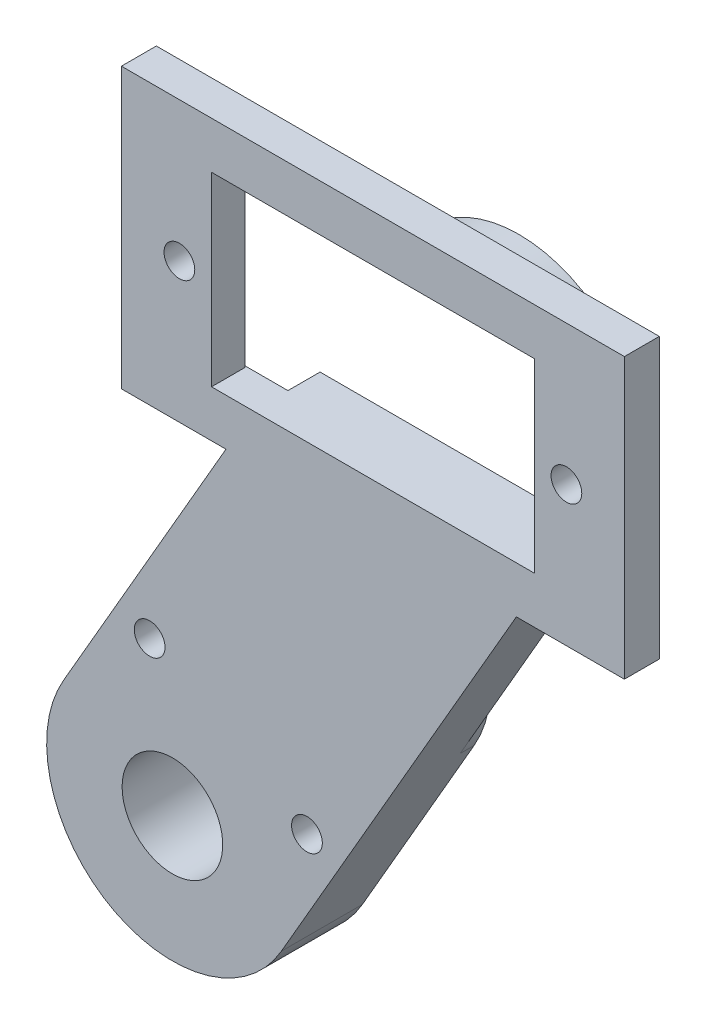
ISO-10303-21;
HEADER;
FILE_DESCRIPTION(('STEP AP214'),'2;1');
FILE_NAME('part.step','',(''),(''),'','','');
FILE_SCHEMA(('AUTOMOTIVE_DESIGN { 1 0 10303 214 1 1 1 1 }'));
ENDSEC;
DATA;
#1=APPLICATION_CONTEXT('core data for automotive mechanical design processes');
#2=APPLICATION_PROTOCOL_DEFINITION('international standard','automotive_design',2000,#1);
#3=PRODUCT_CONTEXT('',#1,'mechanical');
#4=PRODUCT('Part','Part','',(#3));
#5=PRODUCT_RELATED_PRODUCT_CATEGORY('part','',(#4));
#6=PRODUCT_DEFINITION_FORMATION('','',#4);
#7=PRODUCT_DEFINITION_CONTEXT('part definition',#1,'design');
#8=PRODUCT_DEFINITION('design','',#6,#7);
#9=PRODUCT_DEFINITION_SHAPE('','',#8);
#10=(LENGTH_UNIT() NAMED_UNIT(*) SI_UNIT(.MILLI.,.METRE.));
#11=(NAMED_UNIT(*) PLANE_ANGLE_UNIT() SI_UNIT($,.RADIAN.));
#12=(NAMED_UNIT(*) SI_UNIT($,.STERADIAN.) SOLID_ANGLE_UNIT());
#13=UNCERTAINTY_MEASURE_WITH_UNIT(LENGTH_MEASURE(1.E-05),#10,'distance_accuracy_value','');
#14=(GEOMETRIC_REPRESENTATION_CONTEXT(3) GLOBAL_UNCERTAINTY_ASSIGNED_CONTEXT((#13)) GLOBAL_UNIT_ASSIGNED_CONTEXT((#10,
#11,#12)) REPRESENTATION_CONTEXT('',''));
#15=CARTESIAN_POINT('',(0.,0.,0.));
#16=DIRECTION('',(0.,0.,1.));
#17=DIRECTION('',(1.,0.,0.));
#18=AXIS2_PLACEMENT_3D('',#15,#16,#17);
#19=CARTESIAN_POINT('',(9.,9.,5.8));
#20=DIRECTION('',(0.,0.,1.));
#21=DIRECTION('',(0.50000000000019,0.866025403784329,0.));
#22=AXIS2_PLACEMENT_3D('',#19,#20,#21);
#23=CYLINDRICAL_SURFACE('',#22,9.);
#24=DIRECTION('',(0.,0.,1.));
#25=VECTOR('',#24,1.);
#26=CARTESIAN_POINT('',(1.20577136594,13.5,0.));
#27=LINE('',#26,#25);
#28=CARTESIAN_POINT('',(1.20577136594,13.5,0.));
#29=VERTEX_POINT('',#28);
#30=CARTESIAN_POINT('',(1.20577136594,13.5,5.8));
#31=VERTEX_POINT('',#30);
#32=EDGE_CURVE('E583',#29,#31,#27,.T.);
#33=ORIENTED_EDGE('',*,*,#32,.F.);
#34=CARTESIAN_POINT('',(9.,9.,0.));
#35=DIRECTION('',(0.,0.,-1.));
#36=DIRECTION('',(0.50000000000019,0.866025403784329,0.));
#37=AXIS2_PLACEMENT_3D('',#34,#35,#36);
#38=CIRCLE('',#37,9.);
#39=CARTESIAN_POINT('',(16.79422863406,4.5,0.));
#40=VERTEX_POINT('',#39);
#41=EDGE_CURVE('E573',#40,#29,#38,.T.);
#42=ORIENTED_EDGE('',*,*,#41,.F.);
#43=DIRECTION('',(0.,0.,1.));
#44=VECTOR('',#43,1.);
#45=CARTESIAN_POINT('',(16.79422863406,4.5,0.));
#46=LINE('',#45,#44);
#47=CARTESIAN_POINT('',(16.79422863406,4.5,5.8));
#48=VERTEX_POINT('',#47);
#49=EDGE_CURVE('E517',#40,#48,#46,.T.);
#50=ORIENTED_EDGE('',*,*,#49,.T.);
#51=CARTESIAN_POINT('',(9.,9.,5.8));
#52=DIRECTION('',(0.,0.,-1.));
#53=DIRECTION('',(0.50000000000019,0.866025403784329,0.));
#54=AXIS2_PLACEMENT_3D('',#51,#52,#53);
#55=CIRCLE('',#54,9.);
#56=EDGE_CURVE('E9',#48,#31,#55,.T.);
#57=ORIENTED_EDGE('',*,*,#56,.T.);
#58=EDGE_LOOP('',(#33,#42,#50,#57));
#59=FACE_BOUND('',#58,.T.);
#60=ADVANCED_FACE('F15',(#59),#23,.T.);
#61=CARTESIAN_POINT('',(19.,26.320508075689,5.8));
#62=DIRECTION('',(0.,0.,-1.));
#63=DIRECTION('',(0.,-1.,0.));
#64=AXIS2_PLACEMENT_3D('',#61,#62,#63);
#65=PLANE('',#64);
#66=CARTESIAN_POINT('',(37.2,43.641016151378,5.8));
#67=DIRECTION('',(0.,0.,-1.));
#68=DIRECTION('',(0.695676274944964,-0.718355427680963,0.));
#69=AXIS2_PLACEMENT_3D('',#66,#67,#68);
#70=CIRCLE('',#69,1.1);
#71=CARTESIAN_POINT('',(37.9652439024395,42.8508251809289,5.8));
#72=VERTEX_POINT('',#71);
#73=EDGE_CURVE('E196',#72,#72,#70,.T.);
#74=ORIENTED_EDGE('',*,*,#73,.T.);
#75=EDGE_LOOP('',(#74));
#76=FACE_BOUND('',#75,.T.);
#77=DIRECTION('',(1.,0.,0.));
#78=VECTOR('',#77,1.);
#79=CARTESIAN_POINT('',(11.8,50.291016151378,5.8));
#80=LINE('',#79,#78);
#81=CARTESIAN_POINT('',(11.8,50.291016151378,5.8));
#82=VERTEX_POINT('',#81);
#83=CARTESIAN_POINT('',(34.9,50.291016151378,5.8));
#84=VERTEX_POINT('',#83);
#85=EDGE_CURVE('E188',#82,#84,#80,.T.);
#86=ORIENTED_EDGE('',*,*,#85,.T.);
#87=DIRECTION('',(0.,1.,0.));
#88=VECTOR('',#87,1.);
#89=CARTESIAN_POINT('',(34.9,38.305762113533,5.8));
#90=LINE('',#89,#88);
#91=CARTESIAN_POINT('',(34.9,36.991016151378,5.8));
#92=VERTEX_POINT('',#91);
#93=EDGE_CURVE('E40',#92,#84,#90,.T.);
#94=ORIENTED_EDGE('',*,*,#93,.F.);
#95=DIRECTION('',(-1.,0.,0.));
#96=VECTOR('',#95,1.);
#97=CARTESIAN_POINT('',(34.9,36.991016151378,5.8));
#98=LINE('',#97,#96);
#99=CARTESIAN_POINT('',(11.8,36.991016151378,5.8));
#100=VERTEX_POINT('',#99);
#101=EDGE_CURVE('E276',#92,#100,#98,.T.);
#102=ORIENTED_EDGE('',*,*,#101,.T.);
#103=DIRECTION('',(0.,-1.,0.));
#104=VECTOR('',#103,1.);
#105=CARTESIAN_POINT('',(11.8,40.316016151378,5.8));
#106=LINE('',#105,#104);
#107=EDGE_CURVE('E204',#82,#100,#106,.T.);
#108=ORIENTED_EDGE('',*,*,#107,.F.);
#109=EDGE_LOOP('',(#86,#94,#102,#108));
#110=FACE_BOUND('',#109,.T.);
#111=CARTESIAN_POINT('',(9.5,43.641016151378,5.8));
#112=DIRECTION('',(0.,0.,1.));
#113=DIRECTION('',(1.,0.,0.));
#114=AXIS2_PLACEMENT_3D('',#111,#112,#113);
#115=CIRCLE('',#114,1.1);
#116=CARTESIAN_POINT('',(10.6,43.641016151378,5.8));
#117=VERTEX_POINT('',#116);
#118=EDGE_CURVE('E214',#117,#117,#115,.T.);
#119=ORIENTED_EDGE('',*,*,#118,.F.);
#120=EDGE_LOOP('',(#119));
#121=FACE_BOUND('',#120,.T.);
#122=CARTESIAN_POINT('',(18.629165124599,12.678203230276,5.8));
#123=DIRECTION('',(0.,0.,1.));
#124=DIRECTION('',(0.50000000000019,0.866025403784329,0.));
#125=AXIS2_PLACEMENT_3D('',#122,#123,#124);
#126=CIRCLE('',#125,1.1);
#127=CARTESIAN_POINT('',(19.1791651245992,13.6308311744388,5.8));
#128=VERTEX_POINT('',#127);
#129=EDGE_CURVE('E613',#128,#128,#126,.T.);
#130=ORIENTED_EDGE('',*,*,#129,.F.);
#131=EDGE_LOOP('',(#130));
#132=FACE_BOUND('',#131,.T.);
#133=CARTESIAN_POINT('',(7.370834875401,19.178203230276,5.8));
#134=DIRECTION('',(0.,0.,1.));
#135=DIRECTION('',(0.50000000000019,0.866025403784329,0.));
#136=AXIS2_PLACEMENT_3D('',#133,#134,#135);
#137=CIRCLE('',#136,1.1);
#138=CARTESIAN_POINT('',(7.92083487540121,20.1308311744388,5.8));
#139=VERTEX_POINT('',#138);
#140=EDGE_CURVE('E472',#139,#139,#137,.T.);
#141=ORIENTED_EDGE('',*,*,#140,.F.);
#142=EDGE_LOOP('',(#141));
#143=FACE_BOUND('',#142,.T.);
#144=CARTESIAN_POINT('',(9.,9.,5.8));
#145=DIRECTION('',(0.,0.,1.));
#146=DIRECTION('',(0.50000000000019,0.866025403784329,0.));
#147=AXIS2_PLACEMENT_3D('',#144,#145,#146);
#148=CIRCLE('',#147,3.6);
#149=CARTESIAN_POINT('',(10.8000000000007,12.1176914536236,5.8));
#150=VERTEX_POINT('',#149);
#151=EDGE_CURVE('E483',#150,#150,#148,.T.);
#152=ORIENTED_EDGE('',*,*,#151,.F.);
#153=EDGE_LOOP('',(#152));
#154=FACE_BOUND('',#153,.T.);
#155=DIRECTION('',(-0.50000000000019,-0.866025403784329,0.));
#156=VECTOR('',#155,1.);
#157=CARTESIAN_POINT('',(36.79422863406,39.141016151378,5.8));
#158=LINE('',#157,#156);
#159=CARTESIAN_POINT('',(33.618802153517,33.641016151378,5.8));
#160=VERTEX_POINT('',#159);
#161=EDGE_CURVE('E512',#160,#48,#158,.T.);
#162=ORIENTED_EDGE('',*,*,#161,.F.);
#163=DIRECTION('',(-1.,0.,0.));
#164=VECTOR('',#163,1.);
#165=CARTESIAN_POINT('',(41.35,33.641016151378,5.8));
#166=LINE('',#165,#164);
#167=CARTESIAN_POINT('',(41.35,33.641016151378,5.8));
#168=VERTEX_POINT('',#167);
#169=EDGE_CURVE('E349',#168,#160,#166,.T.);
#170=ORIENTED_EDGE('',*,*,#169,.F.);
#171=DIRECTION('',(0.,-1.,0.));
#172=VECTOR('',#171,1.);
#173=CARTESIAN_POINT('',(41.35,53.641016151378,5.8));
#174=LINE('',#173,#172);
#175=CARTESIAN_POINT('',(41.35,53.641016151378,5.8));
#176=VERTEX_POINT('',#175);
#177=EDGE_CURVE('E317',#176,#168,#174,.T.);
#178=ORIENTED_EDGE('',*,*,#177,.F.);
#179=DIRECTION('',(1.,0.,0.));
#180=VECTOR('',#179,1.);
#181=CARTESIAN_POINT('',(5.35,53.641016151378,5.8));
#182=LINE('',#181,#180);
#183=CARTESIAN_POINT('',(5.35,53.641016151378,5.8));
#184=VERTEX_POINT('',#183);
#185=EDGE_CURVE('E253',#184,#176,#182,.T.);
#186=ORIENTED_EDGE('',*,*,#185,.F.);
#187=DIRECTION('',(0.,1.,0.));
#188=VECTOR('',#187,1.);
#189=CARTESIAN_POINT('',(5.35,33.641016151378,5.8));
#190=LINE('',#189,#188);
#191=CARTESIAN_POINT('',(5.35,33.641016151378,5.8));
#192=VERTEX_POINT('',#191);
#193=EDGE_CURVE('E239',#192,#184,#190,.T.);
#194=ORIENTED_EDGE('',*,*,#193,.F.);
#195=DIRECTION('',(-1.,0.,0.));
#196=VECTOR('',#195,1.);
#197=CARTESIAN_POINT('',(41.35,33.641016151378,5.8));
#198=LINE('',#197,#196);
#199=CARTESIAN_POINT('',(12.83419246269,33.641016151378,5.8));
#200=VERTEX_POINT('',#199);
#201=EDGE_CURVE('E24',#200,#192,#198,.T.);
#202=ORIENTED_EDGE('',*,*,#201,.F.);
#203=DIRECTION('',(0.50000000000019,0.866025403784329,0.));
#204=VECTOR('',#203,1.);
#205=CARTESIAN_POINT('',(1.20577136594,13.5,5.8));
#206=LINE('',#205,#204);
#207=EDGE_CURVE('E654',#31,#200,#206,.T.);
#208=ORIENTED_EDGE('',*,*,#207,.F.);
#209=ORIENTED_EDGE('',*,*,#56,.F.);
#210=EDGE_LOOP('',(#162,#170,#178,#186,#194,#202,#208,#209));
#211=FACE_BOUND('',#210,.T.);
#212=ADVANCED_FACE('F249',(#76,#110,#121,#132,#143,#154,#211),#65,.F.);
#213=CARTESIAN_POINT('',(41.35,33.641016151378,5.8));
#214=DIRECTION('',(0.,1.,0.));
#215=DIRECTION('',(0.,0.,-1.));
#216=AXIS2_PLACEMENT_3D('',#213,#214,#215);
#217=PLANE('',#216);
#218=DIRECTION('',(0.,0.,-1.));
#219=VECTOR('',#218,1.);
#220=CARTESIAN_POINT('',(5.35,33.641016151378,5.8));
#221=LINE('',#220,#219);
#222=CARTESIAN_POINT('',(5.35,33.641016151378,3.3));
#223=VERTEX_POINT('',#222);
#224=EDGE_CURVE('E229',#192,#223,#221,.T.);
#225=ORIENTED_EDGE('',*,*,#224,.T.);
#226=DIRECTION('',(-1.,0.,0.));
#227=VECTOR('',#226,1.);
#228=CARTESIAN_POINT('',(41.35,33.641016151378,3.3));
#229=LINE('',#228,#227);
#230=CARTESIAN_POINT('',(12.83419246269,33.641016151378,3.3));
#231=VERTEX_POINT('',#230);
#232=EDGE_CURVE('E216',#231,#223,#229,.T.);
#233=ORIENTED_EDGE('',*,*,#232,.F.);
#234=DIRECTION('',(0.,0.,1.));
#235=VECTOR('',#234,1.);
#236=CARTESIAN_POINT('',(12.83419246269,33.641016151378,5.8));
#237=LINE('',#236,#235);
#238=EDGE_CURVE('E235',#231,#200,#237,.T.);
#239=ORIENTED_EDGE('',*,*,#238,.T.);
#240=ORIENTED_EDGE('',*,*,#201,.T.);
#241=EDGE_LOOP('',(#225,#233,#239,#240));
#242=FACE_BOUND('',#241,.T.);
#243=ADVANCED_FACE('F226',(#242),#217,.F.);
#244=CARTESIAN_POINT('',(23.35,43.641016151378,3.3));
#245=DIRECTION('',(0.,0.,-1.));
#246=DIRECTION('',(0.,-1.,0.));
#247=AXIS2_PLACEMENT_3D('',#244,#245,#246);
#248=PLANE('',#247);
#249=ORIENTED_EDGE('',*,*,#232,.T.);
#250=DIRECTION('',(0.,1.,0.));
#251=VECTOR('',#250,1.);
#252=CARTESIAN_POINT('',(5.35,33.641016151378,3.3));
#253=LINE('',#252,#251);
#254=CARTESIAN_POINT('',(5.35,53.641016151378,3.3));
#255=VERTEX_POINT('',#254);
#256=EDGE_CURVE('E245',#223,#255,#253,.T.);
#257=ORIENTED_EDGE('',*,*,#256,.T.);
#258=DIRECTION('',(1.,0.,0.));
#259=VECTOR('',#258,1.);
#260=CARTESIAN_POINT('',(5.35,53.641016151378,3.3));
#261=LINE('',#260,#259);
#262=CARTESIAN_POINT('',(41.35,53.641016151378,3.3));
#263=VERTEX_POINT('',#262);
#264=EDGE_CURVE('E259',#255,#263,#261,.T.);
#265=ORIENTED_EDGE('',*,*,#264,.T.);
#266=DIRECTION('',(0.,-1.,0.));
#267=VECTOR('',#266,1.);
#268=CARTESIAN_POINT('',(41.35,53.641016151378,3.3));
#269=LINE('',#268,#267);
#270=CARTESIAN_POINT('',(41.35,33.641016151378,3.3));
#271=VERTEX_POINT('',#270);
#272=EDGE_CURVE('E321',#263,#271,#269,.T.);
#273=ORIENTED_EDGE('',*,*,#272,.T.);
#274=DIRECTION('',(-1.,0.,0.));
#275=VECTOR('',#274,1.);
#276=CARTESIAN_POINT('',(41.35,33.641016151378,3.3));
#277=LINE('',#276,#275);
#278=CARTESIAN_POINT('',(33.618802153517,33.641016151378,3.3));
#279=VERTEX_POINT('',#278);
#280=EDGE_CURVE('E351',#271,#279,#277,.T.);
#281=ORIENTED_EDGE('',*,*,#280,.T.);
#282=DIRECTION('',(-0.50000000000019,-0.866025403784329,0.));
#283=VECTOR('',#282,1.);
#284=CARTESIAN_POINT('',(36.08797863406,37.917755268532,3.3));
#285=LINE('',#284,#283);
#286=CARTESIAN_POINT('',(35.552925555302,36.991016151378,3.3));
#287=VERTEX_POINT('',#286);
#288=EDGE_CURVE('E358',#287,#279,#285,.T.);
#289=ORIENTED_EDGE('',*,*,#288,.F.);
#290=DIRECTION('',(1.,0.,0.));
#291=VECTOR('',#290,1.);
#292=CARTESIAN_POINT('',(31.5,36.991016151378,3.3));
#293=LINE('',#292,#291);
#294=CARTESIAN_POINT('',(39.65,36.991016151378,3.3));
#295=VERTEX_POINT('',#294);
#296=EDGE_CURVE('E296',#287,#295,#293,.T.);
#297=ORIENTED_EDGE('',*,*,#296,.T.);
#298=DIRECTION('',(0.,1.,0.));
#299=VECTOR('',#298,1.);
#300=CARTESIAN_POINT('',(39.65,46.966016151378,3.3));
#301=LINE('',#300,#299);
#302=CARTESIAN_POINT('',(39.65,50.291016151378,3.3));
#303=VERTEX_POINT('',#302);
#304=EDGE_CURVE('E171',#295,#303,#301,.T.);
#305=ORIENTED_EDGE('',*,*,#304,.T.);
#306=DIRECTION('',(-1.,0.,0.));
#307=VECTOR('',#306,1.);
#308=CARTESIAN_POINT('',(15.2,50.291016151378,3.3));
#309=LINE('',#308,#307);
#310=CARTESIAN_POINT('',(35.064445564106,50.291016151378,3.3));
#311=VERTEX_POINT('',#310);
#312=EDGE_CURVE('E169',#303,#311,#309,.T.);
#313=ORIENTED_EDGE('',*,*,#312,.T.);
#314=CARTESIAN_POINT('',(29.,43.641016151378,3.3));
#315=DIRECTION('',(0.,0.,1.));
#316=DIRECTION('',(0.50000000000019,0.866025403784329,0.));
#317=AXIS2_PLACEMENT_3D('',#314,#315,#316);
#318=CIRCLE('',#317,9.);
#319=CARTESIAN_POINT('',(22.935554435894,50.291016151378,3.3));
#320=VERTEX_POINT('',#319);
#321=EDGE_CURVE('E155',#311,#320,#318,.T.);
#322=ORIENTED_EDGE('',*,*,#321,.T.);
#323=DIRECTION('',(-1.,0.,0.));
#324=VECTOR('',#323,1.);
#325=CARTESIAN_POINT('',(22.935554435894,50.291016151378,3.3));
#326=LINE('',#325,#324);
#327=CARTESIAN_POINT('',(7.05,50.291016151378,3.3));
#328=VERTEX_POINT('',#327);
#329=EDGE_CURVE('E299',#320,#328,#326,.T.);
#330=ORIENTED_EDGE('',*,*,#329,.T.);
#331=DIRECTION('',(0.,-1.,0.));
#332=VECTOR('',#331,1.);
#333=CARTESIAN_POINT('',(7.05,40.316016151378,3.3));
#334=LINE('',#333,#332);
#335=CARTESIAN_POINT('',(7.05,36.991016151378,3.3));
#336=VERTEX_POINT('',#335);
#337=EDGE_CURVE('E217',#328,#336,#334,.T.);
#338=ORIENTED_EDGE('',*,*,#337,.T.);
#339=DIRECTION('',(1.,0.,0.));
#340=VECTOR('',#339,1.);
#341=CARTESIAN_POINT('',(7.05,36.991016151378,3.3));
#342=LINE('',#341,#340);
#343=CARTESIAN_POINT('',(14.768315864476,36.991016151378,3.3));
#344=VERTEX_POINT('',#343);
#345=EDGE_CURVE('E267',#336,#344,#342,.T.);
#346=ORIENTED_EDGE('',*,*,#345,.T.);
#347=DIRECTION('',(0.50000000000019,0.866025403784329,0.));
#348=VECTOR('',#347,1.);
#349=CARTESIAN_POINT('',(10.49952136594,29.597247192843,3.3));
#350=LINE('',#349,#348);
#351=EDGE_CURVE('E565',#231,#344,#350,.T.);
#352=ORIENTED_EDGE('',*,*,#351,.F.);
#353=EDGE_LOOP('',(#249,#257,#265,#273,#281,#289,#297,#305,#313,#322,#330,#338,#346,#352));
#354=FACE_BOUND('',#353,.T.);
#355=ADVANCED_FACE('F166',(#354),#248,.T.);
#356=CARTESIAN_POINT('',(7.05,36.991016151378,3.4));
#357=DIRECTION('',(1.,0.,0.));
#358=DIRECTION('',(0.,1.,0.));
#359=AXIS2_PLACEMENT_3D('',#356,#357,#358);
#360=PLANE('',#359);
#361=DIRECTION('',(0.,1.,0.));
#362=VECTOR('',#361,1.);
#363=CARTESIAN_POINT('',(7.05,36.991016151378,3.4));
#364=LINE('',#363,#362);
#365=CARTESIAN_POINT('',(7.05,36.991016151378,3.4));
#366=VERTEX_POINT('',#365);
#367=CARTESIAN_POINT('',(7.05,50.291016151378,3.4));
#368=VERTEX_POINT('',#367);
#369=EDGE_CURVE('E209',#366,#368,#364,.T.);
#370=ORIENTED_EDGE('',*,*,#369,.F.);
#371=DIRECTION('',(0.,0.,-1.));
#372=VECTOR('',#371,1.);
#373=CARTESIAN_POINT('',(7.05,36.991016151378,3.4));
#374=LINE('',#373,#372);
#375=EDGE_CURVE('E269',#366,#336,#374,.T.);
#376=ORIENTED_EDGE('',*,*,#375,.T.);
#377=ORIENTED_EDGE('',*,*,#337,.F.);
#378=DIRECTION('',(0.,0.,-1.));
#379=VECTOR('',#378,1.);
#380=CARTESIAN_POINT('',(7.05,50.291016151378,3.4));
#381=LINE('',#380,#379);
#382=EDGE_CURVE('E305',#368,#328,#381,.T.);
#383=ORIENTED_EDGE('',*,*,#382,.F.);
#384=EDGE_LOOP('',(#370,#376,#377,#383));
#385=FACE_BOUND('',#384,.T.);
#386=ADVANCED_FACE('F385',(#385),#360,.T.);
#387=CARTESIAN_POINT('',(9.5,43.641016151378,5.9));
#388=DIRECTION('',(0.,0.,1.));
#389=DIRECTION('',(1.,0.,0.));
#390=AXIS2_PLACEMENT_3D('',#387,#388,#389);
#391=CYLINDRICAL_SURFACE('',#390,1.1);
#392=CARTESIAN_POINT('',(9.5,43.641016151378,3.4));
#393=DIRECTION('',(0.,0.,1.));
#394=DIRECTION('',(1.,0.,0.));
#395=AXIS2_PLACEMENT_3D('',#392,#393,#394);
#396=CIRCLE('',#395,1.1);
#397=CARTESIAN_POINT('',(10.6,43.641016151378,3.4));
#398=VERTEX_POINT('',#397);
#399=EDGE_CURVE('E211',#398,#398,#396,.T.);
#400=ORIENTED_EDGE('',*,*,#399,.F.);
#401=EDGE_LOOP('',(#400));
#402=FACE_BOUND('',#401,.T.);
#403=ORIENTED_EDGE('',*,*,#118,.T.);
#404=EDGE_LOOP('',(#403));
#405=FACE_BOUND('',#404,.T.);
#406=ADVANCED_FACE('F706',(#402,#405),#391,.F.);
#407=CARTESIAN_POINT('',(23.35,43.641016151378,3.4));
#408=DIRECTION('',(0.,0.,-1.));
#409=DIRECTION('',(0.,-1.,0.));
#410=AXIS2_PLACEMENT_3D('',#407,#408,#409);
#411=PLANE('',#410);
#412=ORIENTED_EDGE('',*,*,#399,.T.);
#413=EDGE_LOOP('',(#412));
#414=FACE_BOUND('',#413,.T.);
#415=ORIENTED_EDGE('',*,*,#369,.T.);
#416=DIRECTION('',(1.,0.,0.));
#417=VECTOR('',#416,1.);
#418=CARTESIAN_POINT('',(7.05,50.291016151378,3.4));
#419=LINE('',#418,#417);
#420=CARTESIAN_POINT('',(11.8,50.291016151378,3.4));
#421=VERTEX_POINT('',#420);
#422=EDGE_CURVE('E298',#368,#421,#419,.T.);
#423=ORIENTED_EDGE('',*,*,#422,.T.);
#424=DIRECTION('',(0.,1.,0.));
#425=VECTOR('',#424,1.);
#426=CARTESIAN_POINT('',(11.8,40.316016151378,3.4));
#427=LINE('',#426,#425);
#428=CARTESIAN_POINT('',(11.8,36.991016151378,3.4));
#429=VERTEX_POINT('',#428);
#430=EDGE_CURVE('E210',#429,#421,#427,.T.);
#431=ORIENTED_EDGE('',*,*,#430,.F.);
#432=DIRECTION('',(-1.,0.,0.));
#433=VECTOR('',#432,1.);
#434=CARTESIAN_POINT('',(39.65,36.991016151378,3.4));
#435=LINE('',#434,#433);
#436=EDGE_CURVE('E272',#429,#366,#435,.T.);
#437=ORIENTED_EDGE('',*,*,#436,.T.);
#438=EDGE_LOOP('',(#415,#423,#431,#437));
#439=FACE_BOUND('',#438,.T.);
#440=ADVANCED_FACE('F374',(#414,#439),#411,.T.);
#441=CARTESIAN_POINT('',(11.8,36.991016151378,5.9));
#442=DIRECTION('',(1.,0.,0.));
#443=DIRECTION('',(0.,1.,0.));
#444=AXIS2_PLACEMENT_3D('',#441,#442,#443);
#445=PLANE('',#444);
#446=DIRECTION('',(0.,0.,-1.));
#447=VECTOR('',#446,1.);
#448=CARTESIAN_POINT('',(11.8,50.291016151378,5.9));
#449=LINE('',#448,#447);
#450=EDGE_CURVE('E300',#82,#421,#449,.T.);
#451=ORIENTED_EDGE('',*,*,#450,.F.);
#452=ORIENTED_EDGE('',*,*,#107,.T.);
#453=DIRECTION('',(0.,0.,-1.));
#454=VECTOR('',#453,1.);
#455=CARTESIAN_POINT('',(11.8,36.991016151378,5.9));
#456=LINE('',#455,#454);
#457=EDGE_CURVE('E279',#100,#429,#456,.T.);
#458=ORIENTED_EDGE('',*,*,#457,.T.);
#459=ORIENTED_EDGE('',*,*,#430,.T.);
#460=EDGE_LOOP('',(#451,#452,#458,#459));
#461=FACE_BOUND('',#460,.T.);
#462=ADVANCED_FACE('F390',(#461),#445,.T.);
#463=CARTESIAN_POINT('',(34.9,50.291016151378,6.));
#464=DIRECTION('',(-1.,0.,0.));
#465=DIRECTION('',(0.,0.,1.));
#466=AXIS2_PLACEMENT_3D('',#463,#464,#465);
#467=PLANE('',#466);
#468=DIRECTION('',(0.,0.,-1.));
#469=VECTOR('',#468,1.);
#470=CARTESIAN_POINT('',(34.9,36.991016151378,6.));
#471=LINE('',#470,#469);
#472=CARTESIAN_POINT('',(34.9,36.991016151378,3.4));
#473=VERTEX_POINT('',#472);
#474=EDGE_CURVE('E284',#92,#473,#471,.T.);
#475=ORIENTED_EDGE('',*,*,#474,.F.);
#476=ORIENTED_EDGE('',*,*,#93,.T.);
#477=DIRECTION('',(0.,0.,-1.));
#478=VECTOR('',#477,1.);
#479=CARTESIAN_POINT('',(34.9,50.291016151378,6.));
#480=LINE('',#479,#478);
#481=CARTESIAN_POINT('',(34.9,50.291016151378,3.4));
#482=VERTEX_POINT('',#481);
#483=EDGE_CURVE('E192',#84,#482,#480,.T.);
#484=ORIENTED_EDGE('',*,*,#483,.T.);
#485=DIRECTION('',(0.,-1.,0.));
#486=VECTOR('',#485,1.);
#487=CARTESIAN_POINT('',(34.9,46.966016151378,3.4));
#488=LINE('',#487,#486);
#489=EDGE_CURVE('E163',#482,#473,#488,.T.);
#490=ORIENTED_EDGE('',*,*,#489,.T.);
#491=EDGE_LOOP('',(#475,#476,#484,#490));
#492=FACE_BOUND('',#491,.T.);
#493=ADVANCED_FACE('F678',(#492),#467,.T.);
#494=CARTESIAN_POINT('',(37.2,43.641016151378,5.9));
#495=DIRECTION('',(0.,0.,1.));
#496=DIRECTION('',(1.,0.,0.));
#497=AXIS2_PLACEMENT_3D('',#494,#495,#496);
#498=CYLINDRICAL_SURFACE('',#497,1.1);
#499=ORIENTED_EDGE('',*,*,#73,.F.);
#500=EDGE_LOOP('',(#499));
#501=FACE_BOUND('',#500,.T.);
#502=CARTESIAN_POINT('',(37.2,43.641016151378,3.4));
#503=DIRECTION('',(0.,0.,1.));
#504=DIRECTION('',(1.,0.,0.));
#505=AXIS2_PLACEMENT_3D('',#502,#503,#504);
#506=CIRCLE('',#505,1.1);
#507=CARTESIAN_POINT('',(38.3,43.641016151378,3.4));
#508=VERTEX_POINT('',#507);
#509=EDGE_CURVE('E191',#508,#508,#506,.T.);
#510=ORIENTED_EDGE('',*,*,#509,.F.);
#511=EDGE_LOOP('',(#510));
#512=FACE_BOUND('',#511,.T.);
#513=ADVANCED_FACE('F681',(#501,#512),#498,.F.);
#514=CARTESIAN_POINT('',(23.35,43.641016151378,3.4));
#515=DIRECTION('',(0.,0.,-1.));
#516=DIRECTION('',(0.,-1.,0.));
#517=AXIS2_PLACEMENT_3D('',#514,#515,#516);
#518=PLANE('',#517);
#519=ORIENTED_EDGE('',*,*,#509,.T.);
#520=EDGE_LOOP('',(#519));
#521=FACE_BOUND('',#520,.T.);
#522=ORIENTED_EDGE('',*,*,#489,.F.);
#523=DIRECTION('',(1.,0.,0.));
#524=VECTOR('',#523,1.);
#525=CARTESIAN_POINT('',(7.05,50.291016151378,3.4));
#526=LINE('',#525,#524);
#527=CARTESIAN_POINT('',(39.65,50.291016151378,3.4));
#528=VERTEX_POINT('',#527);
#529=EDGE_CURVE('E177',#482,#528,#526,.T.);
#530=ORIENTED_EDGE('',*,*,#529,.T.);
#531=DIRECTION('',(0.,-1.,0.));
#532=VECTOR('',#531,1.);
#533=CARTESIAN_POINT('',(39.65,50.291016151378,3.4));
#534=LINE('',#533,#532);
#535=CARTESIAN_POINT('',(39.65,36.991016151378,3.4));
#536=VERTEX_POINT('',#535);
#537=EDGE_CURVE('E291',#528,#536,#534,.T.);
#538=ORIENTED_EDGE('',*,*,#537,.T.);
#539=DIRECTION('',(-1.,0.,0.));
#540=VECTOR('',#539,1.);
#541=CARTESIAN_POINT('',(39.65,36.991016151378,3.4));
#542=LINE('',#541,#540);
#543=EDGE_CURVE('E290',#536,#473,#542,.T.);
#544=ORIENTED_EDGE('',*,*,#543,.T.);
#545=EDGE_LOOP('',(#522,#530,#538,#544));
#546=FACE_BOUND('',#545,.T.);
#547=ADVANCED_FACE('F680',(#521,#546),#518,.T.);
#548=CARTESIAN_POINT('',(29.,43.641016151378,5.8));
#549=DIRECTION('',(0.,0.,1.));
#550=DIRECTION('',(0.50000000000019,0.866025403784329,0.));
#551=AXIS2_PLACEMENT_3D('',#548,#549,#550);
#552=CYLINDRICAL_SURFACE('',#551,9.);
#553=DIRECTION('',(0.,0.,1.));
#554=VECTOR('',#553,1.);
#555=CARTESIAN_POINT('',(22.935554435894,50.291016151378,5.8));
#556=LINE('',#555,#554);
#557=CARTESIAN_POINT('',(22.935554435894,50.291016151378,1.));
#558=VERTEX_POINT('',#557);
#559=EDGE_CURVE('E157',#558,#320,#556,.T.);
#560=ORIENTED_EDGE('',*,*,#559,.T.);
#561=ORIENTED_EDGE('',*,*,#321,.F.);
#562=DIRECTION('',(0.,0.,1.));
#563=VECTOR('',#562,1.);
#564=CARTESIAN_POINT('',(35.064445564106,50.291016151378,5.8));
#565=LINE('',#564,#563);
#566=CARTESIAN_POINT('',(35.064445564106,50.291016151378,1.));
#567=VERTEX_POINT('',#566);
#568=EDGE_CURVE('E156',#567,#311,#565,.T.);
#569=ORIENTED_EDGE('',*,*,#568,.F.);
#570=CARTESIAN_POINT('',(29.,43.641016151378,1.));
#571=DIRECTION('',(0.,0.,1.));
#572=DIRECTION('',(0.866025403784329,-0.50000000000019,0.));
#573=AXIS2_PLACEMENT_3D('',#570,#571,#572);
#574=CIRCLE('',#573,9.);
#575=EDGE_CURVE('E144',#567,#558,#574,.T.);
#576=ORIENTED_EDGE('',*,*,#575,.T.);
#577=EDGE_LOOP('',(#560,#561,#569,#576));
#578=FACE_BOUND('',#577,.T.);
#579=ADVANCED_FACE('F152',(#578),#552,.T.);
#580=CARTESIAN_POINT('',(19.,26.320508075689,1.));
#581=DIRECTION('',(0.,0.,-1.));
#582=DIRECTION('',(0.,-1.,0.));
#583=AXIS2_PLACEMENT_3D('',#580,#581,#582);
#584=PLANE('',#583);
#585=ORIENTED_EDGE('',*,*,#575,.F.);
#586=DIRECTION('',(1.,0.,0.));
#587=VECTOR('',#586,1.);
#588=CARTESIAN_POINT('',(22.935554435894,50.291016151378,1.));
#589=LINE('',#588,#587);
#590=EDGE_CURVE('E178',#558,#567,#589,.T.);
#591=ORIENTED_EDGE('',*,*,#590,.F.);
#592=EDGE_LOOP('',(#585,#591));
#593=FACE_BOUND('',#592,.T.);
#594=ADVANCED_FACE('F754',(#593),#584,.T.);
#595=CARTESIAN_POINT('',(11.8,50.291016151378,5.9));
#596=DIRECTION('',(0.,-1.,0.));
#597=DIRECTION('',(-1.,0.,0.));
#598=AXIS2_PLACEMENT_3D('',#595,#596,#597);
#599=PLANE('',#598);
#600=ORIENTED_EDGE('',*,*,#450,.T.);
#601=ORIENTED_EDGE('',*,*,#422,.F.);
#602=ORIENTED_EDGE('',*,*,#382,.T.);
#603=ORIENTED_EDGE('',*,*,#329,.F.);
#604=ORIENTED_EDGE('',*,*,#559,.F.);
#605=ORIENTED_EDGE('',*,*,#590,.T.);
#606=ORIENTED_EDGE('',*,*,#568,.T.);
#607=ORIENTED_EDGE('',*,*,#312,.F.);
#608=DIRECTION('',(0.,0.,-1.));
#609=VECTOR('',#608,1.);
#610=CARTESIAN_POINT('',(39.65,50.291016151378,3.4));
#611=LINE('',#610,#609);
#612=EDGE_CURVE('E294',#528,#303,#611,.T.);
#613=ORIENTED_EDGE('',*,*,#612,.F.);
#614=ORIENTED_EDGE('',*,*,#529,.F.);
#615=ORIENTED_EDGE('',*,*,#483,.F.);
#616=ORIENTED_EDGE('',*,*,#85,.F.);
#617=EDGE_LOOP('',(#600,#601,#602,#603,#604,#605,#606,#607,#613,#614,#615,#616));
#618=FACE_BOUND('',#617,.T.);
#619=ADVANCED_FACE('F176',(#618),#599,.T.);
#620=CARTESIAN_POINT('',(39.65,50.291016151378,3.4));
#621=DIRECTION('',(-1.,0.,0.));
#622=DIRECTION('',(0.,0.,1.));
#623=AXIS2_PLACEMENT_3D('',#620,#621,#622);
#624=PLANE('',#623);
#625=ORIENTED_EDGE('',*,*,#537,.F.);
#626=ORIENTED_EDGE('',*,*,#612,.T.);
#627=ORIENTED_EDGE('',*,*,#304,.F.);
#628=DIRECTION('',(0.,0.,-1.));
#629=VECTOR('',#628,1.);
#630=CARTESIAN_POINT('',(39.65,36.991016151378,3.4));
#631=LINE('',#630,#629);
#632=EDGE_CURVE('E295',#536,#295,#631,.T.);
#633=ORIENTED_EDGE('',*,*,#632,.F.);
#634=EDGE_LOOP('',(#625,#626,#627,#633));
#635=FACE_BOUND('',#634,.T.);
#636=ADVANCED_FACE('F668',(#635),#624,.T.);
#637=CARTESIAN_POINT('',(34.9,36.991016151378,6.));
#638=DIRECTION('',(0.,1.,0.));
#639=DIRECTION('',(0.,0.,-1.));
#640=AXIS2_PLACEMENT_3D('',#637,#638,#639);
#641=PLANE('',#640);
#642=ORIENTED_EDGE('',*,*,#345,.F.);
#643=ORIENTED_EDGE('',*,*,#375,.F.);
#644=ORIENTED_EDGE('',*,*,#436,.F.);
#645=ORIENTED_EDGE('',*,*,#457,.F.);
#646=ORIENTED_EDGE('',*,*,#101,.F.);
#647=ORIENTED_EDGE('',*,*,#474,.T.);
#648=ORIENTED_EDGE('',*,*,#543,.F.);
#649=ORIENTED_EDGE('',*,*,#632,.T.);
#650=ORIENTED_EDGE('',*,*,#296,.F.);
#651=DIRECTION('',(0.,0.,-1.));
#652=VECTOR('',#651,1.);
#653=CARTESIAN_POINT('',(35.552925555302,36.991016151378,4.6));
#654=LINE('',#653,#652);
#655=CARTESIAN_POINT('',(35.552925555302,36.991016151378,1.));
#656=VERTEX_POINT('',#655);
#657=EDGE_CURVE('E365',#287,#656,#654,.T.);
#658=ORIENTED_EDGE('',*,*,#657,.T.);
#659=DIRECTION('',(-1.,0.,0.));
#660=VECTOR('',#659,1.);
#661=CARTESIAN_POINT('',(35.552925555302,36.991016151378,1.));
#662=LINE('',#661,#660);
#663=CARTESIAN_POINT('',(14.768315864476,36.991016151378,1.));
#664=VERTEX_POINT('',#663);
#665=EDGE_CURVE('E264',#656,#664,#662,.T.);
#666=ORIENTED_EDGE('',*,*,#665,.T.);
#667=DIRECTION('',(0.,0.,1.));
#668=VECTOR('',#667,1.);
#669=CARTESIAN_POINT('',(14.768315864476,36.991016151378,5.9));
#670=LINE('',#669,#668);
#671=EDGE_CURVE('E557',#664,#344,#670,.T.);
#672=ORIENTED_EDGE('',*,*,#671,.T.);
#673=EDGE_LOOP('',(#642,#643,#644,#645,#646,#647,#648,#649,#650,#658,#666,#672));
#674=FACE_BOUND('',#673,.T.);
#675=ADVANCED_FACE('F539',(#674),#641,.T.);
#676=CARTESIAN_POINT('',(19.,26.320508075689,1.));
#677=DIRECTION('',(0.,0.,-1.));
#678=DIRECTION('',(0.,-1.,0.));
#679=AXIS2_PLACEMENT_3D('',#676,#677,#678);
#680=PLANE('',#679);
#681=CARTESIAN_POINT('',(17.,22.856406460551,1.));
#682=DIRECTION('',(0.,0.,-1.));
#683=DIRECTION('',(-0.866025403784329,0.50000000000019,0.));
#684=AXIS2_PLACEMENT_3D('',#681,#682,#683);
#685=CIRCLE('',#684,9.);
#686=CARTESIAN_POINT('',(9.20577136594,27.356406460551,1.));
#687=VERTEX_POINT('',#686);
#688=CARTESIAN_POINT('',(24.79422863406,18.356406460551,1.));
#689=VERTEX_POINT('',#688);
#690=EDGE_CURVE('E243',#687,#689,#685,.T.);
#691=ORIENTED_EDGE('',*,*,#690,.F.);
#692=DIRECTION('',(0.50000000000019,0.866025403784329,0.));
#693=VECTOR('',#692,1.);
#694=CARTESIAN_POINT('',(1.20577136594,13.5,1.));
#695=LINE('',#694,#693);
#696=EDGE_CURVE('E552',#687,#664,#695,.T.);
#697=ORIENTED_EDGE('',*,*,#696,.T.);
#698=ORIENTED_EDGE('',*,*,#665,.F.);
#699=DIRECTION('',(-0.50000000000019,-0.866025403784329,0.));
#700=VECTOR('',#699,1.);
#701=CARTESIAN_POINT('',(36.79422863406,39.141016151378,1.));
#702=LINE('',#701,#700);
#703=EDGE_CURVE('E526',#656,#689,#702,.T.);
#704=ORIENTED_EDGE('',*,*,#703,.T.);
#705=EDGE_LOOP('',(#691,#697,#698,#704));
#706=FACE_BOUND('',#705,.T.);
#707=ADVANCED_FACE('F547',(#706),#680,.T.);
#708=CARTESIAN_POINT('',(17.,22.856406460551,1.));
#709=DIRECTION('',(0.,0.,1.));
#710=DIRECTION('',(0.50000000000019,0.866025403784329,0.));
#711=AXIS2_PLACEMENT_3D('',#708,#709,#710);
#712=CYLINDRICAL_SURFACE('',#711,9.);
#713=DIRECTION('',(0.,0.,-1.));
#714=VECTOR('',#713,1.);
#715=CARTESIAN_POINT('',(9.20577136594,27.356406460551,1.));
#716=LINE('',#715,#714);
#717=CARTESIAN_POINT('',(9.20577136594,27.356406460551,0.));
#718=VERTEX_POINT('',#717);
#719=EDGE_CURVE('E556',#687,#718,#716,.T.);
#720=ORIENTED_EDGE('',*,*,#719,.F.);
#721=ORIENTED_EDGE('',*,*,#690,.T.);
#722=DIRECTION('',(0.,0.,-1.));
#723=VECTOR('',#722,1.);
#724=CARTESIAN_POINT('',(24.79422863406,18.356406460551,1.));
#725=LINE('',#724,#723);
#726=CARTESIAN_POINT('',(24.79422863406,18.356406460551,0.));
#727=VERTEX_POINT('',#726);
#728=EDGE_CURVE('E521',#689,#727,#725,.T.);
#729=ORIENTED_EDGE('',*,*,#728,.T.);
#730=CARTESIAN_POINT('',(17.,22.856406460551,0.));
#731=DIRECTION('',(0.,0.,1.));
#732=DIRECTION('',(0.866025403784329,-0.50000000000019,0.));
#733=AXIS2_PLACEMENT_3D('',#730,#731,#732);
#734=CIRCLE('',#733,9.);
#735=EDGE_CURVE('E590',#727,#718,#734,.T.);
#736=ORIENTED_EDGE('',*,*,#735,.T.);
#737=EDGE_LOOP('',(#720,#721,#729,#736));
#738=FACE_BOUND('',#737,.T.);
#739=ADVANCED_FACE('F655',(#738),#712,.T.);
#740=CARTESIAN_POINT('',(5.35,33.641016151378,5.8));
#741=DIRECTION('',(1.,0.,0.));
#742=DIRECTION('',(0.,1.,0.));
#743=AXIS2_PLACEMENT_3D('',#740,#741,#742);
#744=PLANE('',#743);
#745=ORIENTED_EDGE('',*,*,#193,.T.);
#746=DIRECTION('',(0.,0.,-1.));
#747=VECTOR('',#746,1.);
#748=CARTESIAN_POINT('',(5.35,53.641016151378,5.8));
#749=LINE('',#748,#747);
#750=EDGE_CURVE('E251',#184,#255,#749,.T.);
#751=ORIENTED_EDGE('',*,*,#750,.T.);
#752=ORIENTED_EDGE('',*,*,#256,.F.);
#753=ORIENTED_EDGE('',*,*,#224,.F.);
#754=EDGE_LOOP('',(#745,#751,#752,#753));
#755=FACE_BOUND('',#754,.T.);
#756=ADVANCED_FACE('F238',(#755),#744,.F.);
#757=CARTESIAN_POINT('',(5.35,53.641016151378,5.8));
#758=DIRECTION('',(0.,-1.,0.));
#759=DIRECTION('',(-1.,0.,0.));
#760=AXIS2_PLACEMENT_3D('',#757,#758,#759);
#761=PLANE('',#760);
#762=ORIENTED_EDGE('',*,*,#185,.T.);
#763=DIRECTION('',(0.,0.,-1.));
#764=VECTOR('',#763,1.);
#765=CARTESIAN_POINT('',(41.35,53.641016151378,5.8));
#766=LINE('',#765,#764);
#767=EDGE_CURVE('E322',#176,#263,#766,.T.);
#768=ORIENTED_EDGE('',*,*,#767,.T.);
#769=ORIENTED_EDGE('',*,*,#264,.F.);
#770=ORIENTED_EDGE('',*,*,#750,.F.);
#771=EDGE_LOOP('',(#762,#768,#769,#770));
#772=FACE_BOUND('',#771,.T.);
#773=ADVANCED_FACE('F337',(#772),#761,.F.);
#774=CARTESIAN_POINT('',(41.35,53.641016151378,5.8));
#775=DIRECTION('',(-1.,0.,0.));
#776=DIRECTION('',(0.,0.,1.));
#777=AXIS2_PLACEMENT_3D('',#774,#775,#776);
#778=PLANE('',#777);
#779=ORIENTED_EDGE('',*,*,#177,.T.);
#780=DIRECTION('',(0.,0.,-1.));
#781=VECTOR('',#780,1.);
#782=CARTESIAN_POINT('',(41.35,33.641016151378,5.8));
#783=LINE('',#782,#781);
#784=EDGE_CURVE('E345',#168,#271,#783,.T.);
#785=ORIENTED_EDGE('',*,*,#784,.T.);
#786=ORIENTED_EDGE('',*,*,#272,.F.);
#787=ORIENTED_EDGE('',*,*,#767,.F.);
#788=EDGE_LOOP('',(#779,#785,#786,#787));
#789=FACE_BOUND('',#788,.T.);
#790=ADVANCED_FACE('F340',(#789),#778,.F.);
#791=CARTESIAN_POINT('',(41.35,33.641016151378,5.8));
#792=DIRECTION('',(0.,1.,0.));
#793=DIRECTION('',(0.,0.,-1.));
#794=AXIS2_PLACEMENT_3D('',#791,#792,#793);
#795=PLANE('',#794);
#796=DIRECTION('',(0.,0.,-1.));
#797=VECTOR('',#796,1.);
#798=CARTESIAN_POINT('',(33.618802153517,33.641016151378,5.8));
#799=LINE('',#798,#797);
#800=EDGE_CURVE('E357',#160,#279,#799,.T.);
#801=ORIENTED_EDGE('',*,*,#800,.T.);
#802=ORIENTED_EDGE('',*,*,#280,.F.);
#803=ORIENTED_EDGE('',*,*,#784,.F.);
#804=ORIENTED_EDGE('',*,*,#169,.T.);
#805=EDGE_LOOP('',(#801,#802,#803,#804));
#806=FACE_BOUND('',#805,.T.);
#807=ADVANCED_FACE('F353',(#806),#795,.F.);
#808=CARTESIAN_POINT('',(36.79422863406,39.141016151378,5.8));
#809=DIRECTION('',(-0.866025403784329,0.50000000000019,0.));
#810=DIRECTION('',(0.,0.,1.));
#811=AXIS2_PLACEMENT_3D('',#808,#809,#810);
#812=PLANE('',#811);
#813=ORIENTED_EDGE('',*,*,#800,.F.);
#814=ORIENTED_EDGE('',*,*,#161,.T.);
#815=ORIENTED_EDGE('',*,*,#49,.F.);
#816=DIRECTION('',(-0.50000000000019,-0.866025403784329,0.));
#817=VECTOR('',#816,1.);
#818=CARTESIAN_POINT('',(24.79422863406,18.356406460551,0.));
#819=LINE('',#818,#817);
#820=EDGE_CURVE('E595',#727,#40,#819,.T.);
#821=ORIENTED_EDGE('',*,*,#820,.F.);
#822=ORIENTED_EDGE('',*,*,#728,.F.);
#823=ORIENTED_EDGE('',*,*,#703,.F.);
#824=ORIENTED_EDGE('',*,*,#657,.F.);
#825=ORIENTED_EDGE('',*,*,#288,.T.);
#826=EDGE_LOOP('',(#813,#814,#815,#821,#822,#823,#824,#825));
#827=FACE_BOUND('',#826,.T.);
#828=ADVANCED_FACE('F544',(#827),#812,.F.);
#829=CARTESIAN_POINT('',(7.370834875401,19.178203230276,6.));
#830=DIRECTION('',(0.,0.,1.));
#831=DIRECTION('',(0.50000000000019,0.866025403784329,0.));
#832=AXIS2_PLACEMENT_3D('',#829,#830,#831);
#833=CYLINDRICAL_SURFACE('',#832,1.1);
#834=CARTESIAN_POINT('',(7.370834875401,19.178203230276,0.));
#835=DIRECTION('',(0.,0.,1.));
#836=DIRECTION('',(0.50000000000019,0.866025403784329,0.));
#837=AXIS2_PLACEMENT_3D('',#834,#835,#836);
#838=CIRCLE('',#837,1.1);
#839=CARTESIAN_POINT('',(7.92083487540121,20.1308311744388,0.));
#840=VERTEX_POINT('',#839);
#841=EDGE_CURVE('E571',#840,#840,#838,.T.);
#842=ORIENTED_EDGE('',*,*,#841,.F.);
#843=EDGE_LOOP('',(#842));
#844=FACE_BOUND('',#843,.T.);
#845=ORIENTED_EDGE('',*,*,#140,.T.);
#846=EDGE_LOOP('',(#845));
#847=FACE_BOUND('',#846,.T.);
#848=ADVANCED_FACE('F734',(#844,#847),#833,.F.);
#849=CARTESIAN_POINT('',(6.22871870789,10.6,1.1));
#850=DIRECTION('',(0.809978786847054,-0.586459175781039,0.));
#851=DIRECTION('',(0.,0.,-1.));
#852=AXIS2_PLACEMENT_3D('',#849,#850,#851);
#853=PLANE('',#852);
#854=DIRECTION('',(0.586459175781039,0.809978786847054,0.));
#855=VECTOR('',#854,1.);
#856=CARTESIAN_POINT('',(6.22871870789,10.6,1.1));
#857=LINE('',#856,#855);
#858=CARTESIAN_POINT('',(7.408128602507,12.2289232654,1.1));
#859=VERTEX_POINT('',#858);
#860=CARTESIAN_POINT('',(14.777756813566,22.407368354874,1.1));
#861=VERTEX_POINT('',#860);
#862=EDGE_CURVE('E463',#859,#861,#857,.T.);
#863=ORIENTED_EDGE('',*,*,#862,.F.);
#864=DIRECTION('',(0.,0.,1.));
#865=VECTOR('',#864,1.);
#866=CARTESIAN_POINT('',(7.408128602507,12.2289232654,5.9));
#867=LINE('',#866,#865);
#868=CARTESIAN_POINT('',(7.408128602507,12.2289232654,0.));
#869=VERTEX_POINT('',#868);
#870=EDGE_CURVE('E471',#869,#859,#867,.T.);
#871=ORIENTED_EDGE('',*,*,#870,.F.);
#872=DIRECTION('',(-0.586459175781039,-0.809978786847054,0.));
#873=VECTOR('',#872,1.);
#874=CARTESIAN_POINT('',(8.65865706828,13.956070817103,0.));
#875=LINE('',#874,#873);
#876=CARTESIAN_POINT('',(14.777756813566,22.407368354874,0.));
#877=VERTEX_POINT('',#876);
#878=EDGE_CURVE('E470',#877,#869,#875,.T.);
#879=ORIENTED_EDGE('',*,*,#878,.F.);
#880=DIRECTION('',(0.,0.,-1.));
#881=VECTOR('',#880,1.);
#882=CARTESIAN_POINT('',(14.777756813566,22.407368354874,1.1));
#883=LINE('',#882,#881);
#884=EDGE_CURVE('E459',#861,#877,#883,.T.);
#885=ORIENTED_EDGE('',*,*,#884,.F.);
#886=EDGE_LOOP('',(#863,#871,#879,#885));
#887=FACE_BOUND('',#886,.T.);
#888=ADVANCED_FACE('F465',(#887),#853,.T.);
#889=CARTESIAN_POINT('',(16.25,21.557368354874,1.1));
#890=DIRECTION('',(0.,0.,1.));
#891=DIRECTION('',(0.50000000000019,0.866025403784329,0.));
#892=AXIS2_PLACEMENT_3D('',#889,#890,#891);
#893=CYLINDRICAL_SURFACE('',#892,1.7);
#894=DIRECTION('',(0.,0.,-1.));
#895=VECTOR('',#894,1.);
#896=CARTESIAN_POINT('',(17.722243186434,20.707368354874,1.1));
#897=LINE('',#896,#895);
#898=CARTESIAN_POINT('',(17.722243186434,20.707368354874,1.1));
#899=VERTEX_POINT('',#898);
#900=CARTESIAN_POINT('',(17.722243186434,20.707368354874,0.));
#901=VERTEX_POINT('',#900);
#902=EDGE_CURVE('E476',#899,#901,#897,.T.);
#903=ORIENTED_EDGE('',*,*,#902,.F.);
#904=CARTESIAN_POINT('',(16.25,21.557368354874,1.1));
#905=DIRECTION('',(0.,0.,1.));
#906=DIRECTION('',(0.866025403784329,-0.50000000000019,0.));
#907=AXIS2_PLACEMENT_3D('',#904,#905,#906);
#908=CIRCLE('',#907,1.7);
#909=EDGE_CURVE('E478',#899,#861,#908,.T.);
#910=ORIENTED_EDGE('',*,*,#909,.T.);
#911=ORIENTED_EDGE('',*,*,#884,.T.);
#912=CARTESIAN_POINT('',(16.25,21.557368354874,0.));
#913=DIRECTION('',(0.,0.,1.));
#914=DIRECTION('',(0.50000000000019,0.866025403784329,0.));
#915=AXIS2_PLACEMENT_3D('',#912,#913,#914);
#916=CIRCLE('',#915,1.7);
#917=EDGE_CURVE('E604',#901,#877,#916,.T.);
#918=ORIENTED_EDGE('',*,*,#917,.F.);
#919=EDGE_LOOP('',(#903,#910,#911,#918));
#920=FACE_BOUND('',#919,.T.);
#921=ADVANCED_FACE('F480',(#920),#893,.F.);
#922=CARTESIAN_POINT('',(9.,9.,5.9));
#923=DIRECTION('',(0.,0.,1.));
#924=DIRECTION('',(0.50000000000019,0.866025403784329,0.));
#925=AXIS2_PLACEMENT_3D('',#922,#923,#924);
#926=CYLINDRICAL_SURFACE('',#925,3.6);
#927=CARTESIAN_POINT('',(9.,9.,1.1));
#928=DIRECTION('',(0.,0.,1.));
#929=DIRECTION('',(0.50000000000019,0.866025403784329,0.));
#930=AXIS2_PLACEMENT_3D('',#927,#928,#929);
#931=CIRCLE('',#930,3.6);
#932=CARTESIAN_POINT('',(12.592265273454,9.235860562914,1.1));
#933=VERTEX_POINT('',#932);
#934=EDGE_CURVE('E486',#933,#859,#931,.T.);
#935=ORIENTED_EDGE('',*,*,#934,.F.);
#936=DIRECTION('',(0.,0.,1.));
#937=VECTOR('',#936,1.);
#938=CARTESIAN_POINT('',(12.592265273454,9.235860562914,5.9));
#939=LINE('',#938,#937);
#940=CARTESIAN_POINT('',(12.592265273454,9.235860562914,0.));
#941=VERTEX_POINT('',#940);
#942=EDGE_CURVE('E492',#941,#933,#939,.T.);
#943=ORIENTED_EDGE('',*,*,#942,.F.);
#944=CARTESIAN_POINT('',(9.,9.,0.));
#945=DIRECTION('',(0.,0.,1.));
#946=DIRECTION('',(0.50000000000019,0.866025403784329,0.));
#947=AXIS2_PLACEMENT_3D('',#944,#945,#946);
#948=CIRCLE('',#947,3.6);
#949=EDGE_CURVE('E585',#869,#941,#948,.T.);
#950=ORIENTED_EDGE('',*,*,#949,.F.);
#951=ORIENTED_EDGE('',*,*,#870,.T.);
#952=EDGE_LOOP('',(#935,#943,#950,#951));
#953=FACE_BOUND('',#952,.T.);
#954=ORIENTED_EDGE('',*,*,#151,.T.);
#955=EDGE_LOOP('',(#954));
#956=FACE_BOUND('',#955,.T.);
#957=ADVANCED_FACE('F631',(#953,#956),#926,.F.);
#958=CARTESIAN_POINT('',(12.345830005196,14.795147562488,1.1));
#959=DIRECTION('',(0.,0.,-1.));
#960=DIRECTION('',(0.,-1.,0.));
#961=AXIS2_PLACEMENT_3D('',#958,#959,#960);
#962=PLANE('',#961);
#963=ORIENTED_EDGE('',*,*,#934,.T.);
#964=ORIENTED_EDGE('',*,*,#862,.T.);
#965=ORIENTED_EDGE('',*,*,#909,.F.);
#966=DIRECTION('',(-0.408232618045233,-0.912877937932522,0.));
#967=VECTOR('',#966,1.);
#968=CARTESIAN_POINT('',(17.722243186434,20.707368354874,1.1));
#969=LINE('',#968,#967);
#970=EDGE_CURVE('E619',#899,#933,#969,.T.);
#971=ORIENTED_EDGE('',*,*,#970,.T.);
#972=EDGE_LOOP('',(#963,#964,#965,#971));
#973=FACE_BOUND('',#972,.T.);
#974=ADVANCED_FACE('F484',(#973),#962,.T.);
#975=CARTESIAN_POINT('',(17.722243186434,20.707368354874,1.1));
#976=DIRECTION('',(-0.912877937932522,0.408232618045233,0.));
#977=DIRECTION('',(0.,0.,1.));
#978=AXIS2_PLACEMENT_3D('',#975,#976,#977);
#979=PLANE('',#978);
#980=ORIENTED_EDGE('',*,*,#970,.F.);
#981=ORIENTED_EDGE('',*,*,#902,.T.);
#982=DIRECTION('',(0.408232618045233,0.912877937932522,0.));
#983=VECTOR('',#982,1.);
#984=CARTESIAN_POINT('',(16.438235643588,17.836107935717,0.));
#985=LINE('',#984,#983);
#986=EDGE_CURVE('E601',#941,#901,#985,.T.);
#987=ORIENTED_EDGE('',*,*,#986,.F.);
#988=ORIENTED_EDGE('',*,*,#942,.T.);
#989=EDGE_LOOP('',(#980,#981,#987,#988));
#990=FACE_BOUND('',#989,.T.);
#991=ADVANCED_FACE('F632',(#990),#979,.T.);
#992=CARTESIAN_POINT('',(18.629165124599,12.678203230276,6.));
#993=DIRECTION('',(0.,0.,1.));
#994=DIRECTION('',(0.50000000000019,0.866025403784329,0.));
#995=AXIS2_PLACEMENT_3D('',#992,#993,#994);
#996=CYLINDRICAL_SURFACE('',#995,1.1);
#997=CARTESIAN_POINT('',(18.629165124599,12.678203230276,0.));
#998=DIRECTION('',(0.,0.,1.));
#999=DIRECTION('',(0.50000000000019,0.866025403784329,0.));
#1000=AXIS2_PLACEMENT_3D('',#997,#998,#999);
#1001=CIRCLE('',#1000,1.1);
#1002=CARTESIAN_POINT('',(19.1791651245992,13.6308311744388,0.));
#1003=VERTEX_POINT('',#1002);
#1004=EDGE_CURVE('E609',#1003,#1003,#1001,.T.);
#1005=ORIENTED_EDGE('',*,*,#1004,.F.);
#1006=EDGE_LOOP('',(#1005));
#1007=FACE_BOUND('',#1006,.T.);
#1008=ORIENTED_EDGE('',*,*,#129,.T.);
#1009=EDGE_LOOP('',(#1008));
#1010=FACE_BOUND('',#1009,.T.);
#1011=ADVANCED_FACE('F639',(#1007,#1010),#996,.F.);
#1012=CARTESIAN_POINT('',(13.,15.928203230276,0.));
#1013=DIRECTION('',(0.,0.,-1.));
#1014=DIRECTION('',(0.,-1.,0.));
#1015=AXIS2_PLACEMENT_3D('',#1012,#1013,#1014);
#1016=PLANE('',#1015);
#1017=ORIENTED_EDGE('',*,*,#1004,.T.);
#1018=EDGE_LOOP('',(#1017));
#1019=FACE_BOUND('',#1018,.T.);
#1020=ORIENTED_EDGE('',*,*,#878,.T.);
#1021=ORIENTED_EDGE('',*,*,#949,.T.);
#1022=ORIENTED_EDGE('',*,*,#986,.T.);
#1023=ORIENTED_EDGE('',*,*,#917,.T.);
#1024=EDGE_LOOP('',(#1020,#1021,#1022,#1023));
#1025=FACE_BOUND('',#1024,.T.);
#1026=ORIENTED_EDGE('',*,*,#841,.T.);
#1027=EDGE_LOOP('',(#1026));
#1028=FACE_BOUND('',#1027,.T.);
#1029=DIRECTION('',(0.50000000000019,0.866025403784329,0.));
#1030=VECTOR('',#1029,1.);
#1031=CARTESIAN_POINT('',(1.20577136594,13.5,0.));
#1032=LINE('',#1031,#1030);
#1033=EDGE_CURVE('E577',#29,#718,#1032,.T.);
#1034=ORIENTED_EDGE('',*,*,#1033,.T.);
#1035=ORIENTED_EDGE('',*,*,#735,.F.);
#1036=ORIENTED_EDGE('',*,*,#820,.T.);
#1037=ORIENTED_EDGE('',*,*,#41,.T.);
#1038=EDGE_LOOP('',(#1034,#1035,#1036,#1037));
#1039=FACE_BOUND('',#1038,.T.);
#1040=ADVANCED_FACE('F637',(#1019,#1025,#1028,#1039),#1016,.T.);
#1041=CARTESIAN_POINT('',(1.20577136594,13.5,5.8));
#1042=DIRECTION('',(0.866025403784329,-0.50000000000019,0.));
#1043=DIRECTION('',(0.,0.,-1.));
#1044=AXIS2_PLACEMENT_3D('',#1041,#1042,#1043);
#1045=PLANE('',#1044);
#1046=ORIENTED_EDGE('',*,*,#207,.T.);
#1047=ORIENTED_EDGE('',*,*,#238,.F.);
#1048=ORIENTED_EDGE('',*,*,#351,.T.);
#1049=ORIENTED_EDGE('',*,*,#671,.F.);
#1050=ORIENTED_EDGE('',*,*,#696,.F.);
#1051=ORIENTED_EDGE('',*,*,#719,.T.);
#1052=ORIENTED_EDGE('',*,*,#1033,.F.);
#1053=ORIENTED_EDGE('',*,*,#32,.T.);
#1054=EDGE_LOOP('',(#1046,#1047,#1048,#1049,#1050,#1051,#1052,#1053));
#1055=FACE_BOUND('',#1054,.T.);
#1056=ADVANCED_FACE('F560',(#1055),#1045,.F.);
#1057=CLOSED_SHELL('',(#60,#212,#243,#355,#386,#406,#440,#462,#493,#513,#547,#579,#594,#619,
#636,#675,#707,#739,#756,#773,#790,#807,#828,#848,#888,#921,#957,#974,#991,#1011,#1040,#1056));
#1058=MANIFOLD_SOLID_BREP('B1',#1057);
#1059=ADVANCED_BREP_SHAPE_REPRESENTATION('',(#18,#1058),#14);
#1060=SHAPE_DEFINITION_REPRESENTATION(#9,#1059);
ENDSEC;
END-ISO-10303-21;
